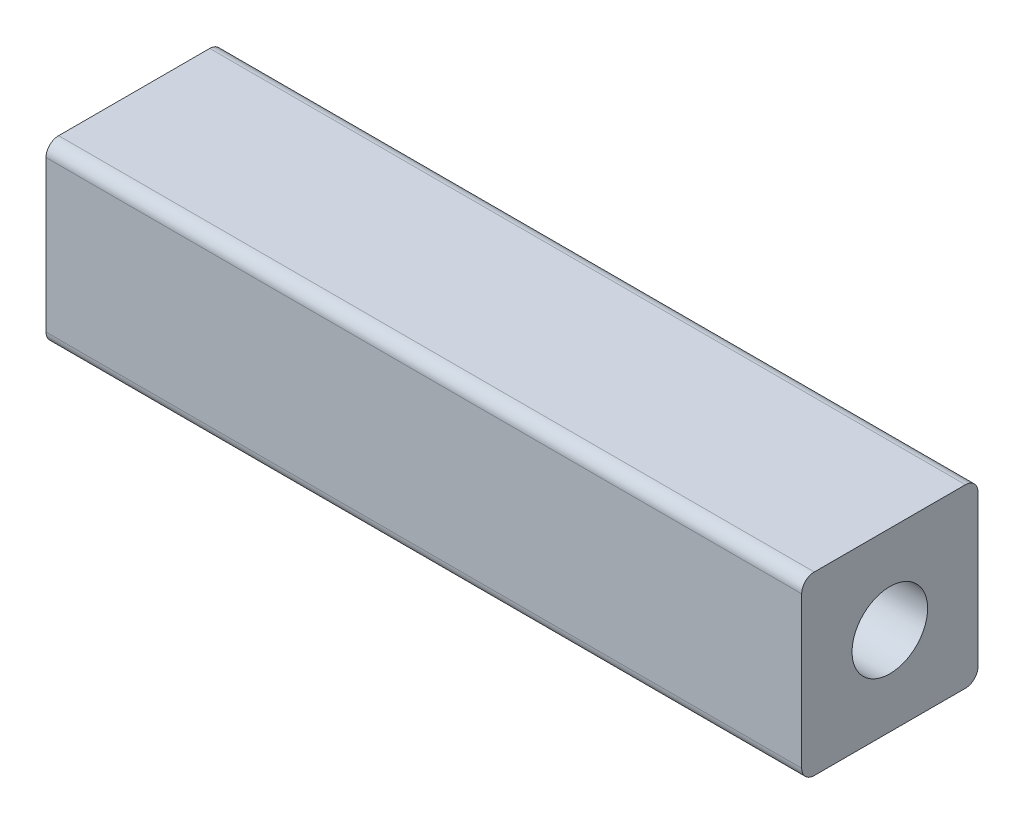
ISO-10303-21;
HEADER;
FILE_DESCRIPTION(('STEP AP214'),'2;1');
FILE_NAME('part.step','',(''),(''),'','','');
FILE_SCHEMA(('AUTOMOTIVE_DESIGN { 1 0 10303 214 1 1 1 1 }'));
ENDSEC;
DATA;
#1=APPLICATION_CONTEXT('core data for automotive mechanical design processes');
#2=APPLICATION_PROTOCOL_DEFINITION('international standard','automotive_design',2000,#1);
#3=PRODUCT_CONTEXT('',#1,'mechanical');
#4=PRODUCT('Part','Part','',(#3));
#5=PRODUCT_RELATED_PRODUCT_CATEGORY('part','',(#4));
#6=PRODUCT_DEFINITION_FORMATION('','',#4);
#7=PRODUCT_DEFINITION_CONTEXT('part definition',#1,'design');
#8=PRODUCT_DEFINITION('design','',#6,#7);
#9=PRODUCT_DEFINITION_SHAPE('','',#8);
#10=(LENGTH_UNIT() NAMED_UNIT(*) SI_UNIT(.MILLI.,.METRE.));
#11=(NAMED_UNIT(*) PLANE_ANGLE_UNIT() SI_UNIT($,.RADIAN.));
#12=(NAMED_UNIT(*) SI_UNIT($,.STERADIAN.) SOLID_ANGLE_UNIT());
#13=UNCERTAINTY_MEASURE_WITH_UNIT(LENGTH_MEASURE(1.E-05),#10,'distance_accuracy_value','');
#14=(GEOMETRIC_REPRESENTATION_CONTEXT(3) GLOBAL_UNCERTAINTY_ASSIGNED_CONTEXT((#13)) GLOBAL_UNIT_ASSIGNED_CONTEXT((#10,
#11,#12)) REPRESENTATION_CONTEXT('',''));
#15=CARTESIAN_POINT('',(0.,0.,0.));
#16=DIRECTION('',(0.,0.,1.));
#17=DIRECTION('',(1.,0.,0.));
#18=AXIS2_PLACEMENT_3D('',#15,#16,#17);
#19=CARTESIAN_POINT('',(60.,7.,-7.));
#20=DIRECTION('',(0.,0.,1.));
#21=DIRECTION('',(0.,-1.,0.));
#22=AXIS2_PLACEMENT_3D('',#19,#20,#21);
#23=PLANE('',#22);
#24=DIRECTION('',(0.,1.,0.));
#25=VECTOR('',#24,1.);
#26=CARTESIAN_POINT('',(60.,7.,-7.));
#27=LINE('',#26,#25);
#28=CARTESIAN_POINT('',(60.,-6.,-7.));
#29=VERTEX_POINT('',#28);
#30=CARTESIAN_POINT('',(60.,6.,-7.));
#31=VERTEX_POINT('',#30);
#32=EDGE_CURVE('E122',#29,#31,#27,.T.);
#33=ORIENTED_EDGE('',*,*,#32,.F.);
#34=DIRECTION('',(-1.,0.,0.));
#35=VECTOR('',#34,1.);
#36=CARTESIAN_POINT('',(60.,-6.,-7.));
#37=LINE('',#36,#35);
#38=CARTESIAN_POINT('',(0.,-6.,-7.));
#39=VERTEX_POINT('',#38);
#40=EDGE_CURVE('E107',#29,#39,#37,.T.);
#41=ORIENTED_EDGE('',*,*,#40,.T.);
#42=DIRECTION('',(0.,1.,0.));
#43=VECTOR('',#42,1.);
#44=CARTESIAN_POINT('',(0.,7.,-7.));
#45=LINE('',#44,#43);
#46=CARTESIAN_POINT('',(0.,6.,-7.));
#47=VERTEX_POINT('',#46);
#48=EDGE_CURVE('E119',#39,#47,#45,.T.);
#49=ORIENTED_EDGE('',*,*,#48,.T.);
#50=DIRECTION('',(-1.,0.,0.));
#51=VECTOR('',#50,1.);
#52=CARTESIAN_POINT('',(60.,6.,-7.));
#53=LINE('',#52,#51);
#54=EDGE_CURVE('E124',#47,#31,#53,.F.);
#55=ORIENTED_EDGE('',*,*,#54,.T.);
#56=EDGE_LOOP('',(#33,#41,#49,#55));
#57=FACE_BOUND('',#56,.T.);
#58=ADVANCED_FACE('F37',(#57),#23,.F.);
#59=CARTESIAN_POINT('',(60.,7.,7.));
#60=DIRECTION('',(0.,-1.,0.));
#61=DIRECTION('',(0.,0.,-1.));
#62=AXIS2_PLACEMENT_3D('',#59,#60,#61);
#63=PLANE('',#62);
#64=DIRECTION('',(0.,0.,1.));
#65=VECTOR('',#64,1.);
#66=CARTESIAN_POINT('',(0.,7.,7.));
#67=LINE('',#66,#65);
#68=CARTESIAN_POINT('',(0.,7.,-6.));
#69=VERTEX_POINT('',#68);
#70=CARTESIAN_POINT('',(0.,7.,6.));
#71=VERTEX_POINT('',#70);
#72=EDGE_CURVE('E128',#69,#71,#67,.T.);
#73=ORIENTED_EDGE('',*,*,#72,.T.);
#74=DIRECTION('',(-1.,0.,0.));
#75=VECTOR('',#74,1.);
#76=CARTESIAN_POINT('',(60.,7.,6.));
#77=LINE('',#76,#75);
#78=CARTESIAN_POINT('',(60.,7.,6.));
#79=VERTEX_POINT('',#78);
#80=EDGE_CURVE('E11',#71,#79,#77,.F.);
#81=ORIENTED_EDGE('',*,*,#80,.T.);
#82=DIRECTION('',(0.,0.,1.));
#83=VECTOR('',#82,1.);
#84=CARTESIAN_POINT('',(60.,7.,7.));
#85=LINE('',#84,#83);
#86=CARTESIAN_POINT('',(60.,7.,-6.));
#87=VERTEX_POINT('',#86);
#88=EDGE_CURVE('E168',#87,#79,#85,.T.);
#89=ORIENTED_EDGE('',*,*,#88,.F.);
#90=DIRECTION('',(-1.,0.,0.));
#91=VECTOR('',#90,1.);
#92=CARTESIAN_POINT('',(60.,7.,-6.));
#93=LINE('',#92,#91);
#94=EDGE_CURVE('E45',#87,#69,#93,.T.);
#95=ORIENTED_EDGE('',*,*,#94,.T.);
#96=EDGE_LOOP('',(#73,#81,#89,#95));
#97=FACE_BOUND('',#96,.T.);
#98=ADVANCED_FACE('F166',(#97),#63,.F.);
#99=CARTESIAN_POINT('',(60.,7.,7.));
#100=DIRECTION('',(0.,0.,-1.));
#101=DIRECTION('',(0.,1.,0.));
#102=AXIS2_PLACEMENT_3D('',#99,#100,#101);
#103=PLANE('',#102);
#104=DIRECTION('',(0.,-1.,0.));
#105=VECTOR('',#104,1.);
#106=CARTESIAN_POINT('',(0.,7.,7.));
#107=LINE('',#106,#105);
#108=CARTESIAN_POINT('',(0.,6.,7.));
#109=VERTEX_POINT('',#108);
#110=CARTESIAN_POINT('',(0.,-6.,7.));
#111=VERTEX_POINT('',#110);
#112=EDGE_CURVE('E132',#109,#111,#107,.T.);
#113=ORIENTED_EDGE('',*,*,#112,.T.);
#114=DIRECTION('',(-1.,0.,0.));
#115=VECTOR('',#114,1.);
#116=CARTESIAN_POINT('',(60.,-6.,7.));
#117=LINE('',#116,#115);
#118=CARTESIAN_POINT('',(60.,-6.,7.));
#119=VERTEX_POINT('',#118);
#120=EDGE_CURVE('E52',#111,#119,#117,.F.);
#121=ORIENTED_EDGE('',*,*,#120,.T.);
#122=DIRECTION('',(0.,-1.,0.));
#123=VECTOR('',#122,1.);
#124=CARTESIAN_POINT('',(60.,7.,7.));
#125=LINE('',#124,#123);
#126=CARTESIAN_POINT('',(60.,6.,7.));
#127=VERTEX_POINT('',#126);
#128=EDGE_CURVE('E176',#127,#119,#125,.T.);
#129=ORIENTED_EDGE('',*,*,#128,.F.);
#130=DIRECTION('',(-1.,0.,0.));
#131=VECTOR('',#130,1.);
#132=CARTESIAN_POINT('',(60.,6.,7.));
#133=LINE('',#132,#131);
#134=EDGE_CURVE('E159',#127,#109,#133,.T.);
#135=ORIENTED_EDGE('',*,*,#134,.T.);
#136=EDGE_LOOP('',(#113,#121,#129,#135));
#137=FACE_BOUND('',#136,.T.);
#138=ADVANCED_FACE('F175',(#137),#103,.F.);
#139=CARTESIAN_POINT('',(60.,-7.,7.));
#140=DIRECTION('',(0.,1.,0.));
#141=DIRECTION('',(0.,0.,1.));
#142=AXIS2_PLACEMENT_3D('',#139,#140,#141);
#143=PLANE('',#142);
#144=DIRECTION('',(0.,0.,-1.));
#145=VECTOR('',#144,1.);
#146=CARTESIAN_POINT('',(0.,-7.,7.));
#147=LINE('',#146,#145);
#148=CARTESIAN_POINT('',(0.,-7.,6.));
#149=VERTEX_POINT('',#148);
#150=CARTESIAN_POINT('',(0.,-7.,-6.));
#151=VERTEX_POINT('',#150);
#152=EDGE_CURVE('E142',#149,#151,#147,.T.);
#153=ORIENTED_EDGE('',*,*,#152,.T.);
#154=DIRECTION('',(-1.,0.,0.));
#155=VECTOR('',#154,1.);
#156=CARTESIAN_POINT('',(60.,-7.,-6.));
#157=LINE('',#156,#155);
#158=CARTESIAN_POINT('',(60.,-7.,-6.));
#159=VERTEX_POINT('',#158);
#160=EDGE_CURVE('E108',#151,#159,#157,.F.);
#161=ORIENTED_EDGE('',*,*,#160,.T.);
#162=DIRECTION('',(0.,0.,-1.));
#163=VECTOR('',#162,1.);
#164=CARTESIAN_POINT('',(60.,-7.,7.));
#165=LINE('',#164,#163);
#166=CARTESIAN_POINT('',(60.,-7.,6.));
#167=VERTEX_POINT('',#166);
#168=EDGE_CURVE('E138',#167,#159,#165,.T.);
#169=ORIENTED_EDGE('',*,*,#168,.F.);
#170=DIRECTION('',(-1.,0.,0.));
#171=VECTOR('',#170,1.);
#172=CARTESIAN_POINT('',(60.,-7.,6.));
#173=LINE('',#172,#171);
#174=EDGE_CURVE('E113',#167,#149,#173,.T.);
#175=ORIENTED_EDGE('',*,*,#174,.T.);
#176=EDGE_LOOP('',(#153,#161,#169,#175));
#177=FACE_BOUND('',#176,.T.);
#178=ADVANCED_FACE('F189',(#177),#143,.F.);
#179=CARTESIAN_POINT('',(60.,0.,0.));
#180=DIRECTION('',(1.,0.,0.));
#181=DIRECTION('',(0.,0.,-1.));
#182=AXIS2_PLACEMENT_3D('',#179,#180,#181);
#183=PLANE('',#182);
#184=CARTESIAN_POINT('',(60.,0.,0.));
#185=DIRECTION('',(1.,0.,0.));
#186=DIRECTION('',(0.,0.,-1.));
#187=AXIS2_PLACEMENT_3D('',#184,#185,#186);
#188=CIRCLE('',#187,3.);
#189=CARTESIAN_POINT('',(60.,0.,-3.));
#190=VERTEX_POINT('',#189);
#191=EDGE_CURVE('E135',#190,#190,#188,.T.);
#192=ORIENTED_EDGE('',*,*,#191,.F.);
#193=EDGE_LOOP('',(#192));
#194=FACE_BOUND('',#193,.T.);
#195=ORIENTED_EDGE('',*,*,#168,.T.);
#196=CARTESIAN_POINT('',(60.,-6.,-6.));
#197=DIRECTION('',(1.,0.,0.));
#198=DIRECTION('',(0.,0.,-1.));
#199=AXIS2_PLACEMENT_3D('',#196,#197,#198);
#200=CIRCLE('',#199,1.);
#201=EDGE_CURVE('E157',#159,#29,#200,.T.);
#202=ORIENTED_EDGE('',*,*,#201,.T.);
#203=ORIENTED_EDGE('',*,*,#32,.T.);
#204=CARTESIAN_POINT('',(60.,6.,-6.));
#205=DIRECTION('',(1.,0.,0.));
#206=DIRECTION('',(0.,0.,-1.));
#207=AXIS2_PLACEMENT_3D('',#204,#205,#206);
#208=CIRCLE('',#207,1.);
#209=EDGE_CURVE('E152',#31,#87,#208,.T.);
#210=ORIENTED_EDGE('',*,*,#209,.T.);
#211=ORIENTED_EDGE('',*,*,#88,.T.);
#212=CARTESIAN_POINT('',(60.,6.,6.));
#213=DIRECTION('',(1.,0.,0.));
#214=DIRECTION('',(0.,0.,-1.));
#215=AXIS2_PLACEMENT_3D('',#212,#213,#214);
#216=CIRCLE('',#215,1.);
#217=EDGE_CURVE('E59',#79,#127,#216,.T.);
#218=ORIENTED_EDGE('',*,*,#217,.T.);
#219=ORIENTED_EDGE('',*,*,#128,.T.);
#220=CARTESIAN_POINT('',(60.,-6.,6.));
#221=DIRECTION('',(1.,0.,0.));
#222=DIRECTION('',(0.,0.,-1.));
#223=AXIS2_PLACEMENT_3D('',#220,#221,#222);
#224=CIRCLE('',#223,1.);
#225=EDGE_CURVE('E155',#119,#167,#224,.T.);
#226=ORIENTED_EDGE('',*,*,#225,.T.);
#227=EDGE_LOOP('',(#195,#202,#203,#210,#211,#218,#219,#226));
#228=FACE_BOUND('',#227,.T.);
#229=ADVANCED_FACE('F187',(#194,#228),#183,.T.);
#230=CARTESIAN_POINT('',(0.,0.,0.));
#231=DIRECTION('',(1.,0.,0.));
#232=DIRECTION('',(0.,0.,-1.));
#233=AXIS2_PLACEMENT_3D('',#230,#231,#232);
#234=PLANE('',#233);
#235=ORIENTED_EDGE('',*,*,#48,.F.);
#236=CARTESIAN_POINT('',(0.,-6.,-6.));
#237=DIRECTION('',(1.,0.,0.));
#238=DIRECTION('',(0.,0.,-1.));
#239=AXIS2_PLACEMENT_3D('',#236,#237,#238);
#240=CIRCLE('',#239,1.);
#241=EDGE_CURVE('E103',#39,#151,#240,.F.);
#242=ORIENTED_EDGE('',*,*,#241,.T.);
#243=ORIENTED_EDGE('',*,*,#152,.F.);
#244=CARTESIAN_POINT('',(0.,-6.,6.));
#245=DIRECTION('',(1.,0.,0.));
#246=DIRECTION('',(0.,0.,-1.));
#247=AXIS2_PLACEMENT_3D('',#244,#245,#246);
#248=CIRCLE('',#247,1.);
#249=EDGE_CURVE('E114',#149,#111,#248,.F.);
#250=ORIENTED_EDGE('',*,*,#249,.T.);
#251=ORIENTED_EDGE('',*,*,#112,.F.);
#252=CARTESIAN_POINT('',(0.,6.,6.));
#253=DIRECTION('',(1.,0.,0.));
#254=DIRECTION('',(0.,0.,-1.));
#255=AXIS2_PLACEMENT_3D('',#252,#253,#254);
#256=CIRCLE('',#255,1.);
#257=EDGE_CURVE('E146',#109,#71,#256,.F.);
#258=ORIENTED_EDGE('',*,*,#257,.T.);
#259=ORIENTED_EDGE('',*,*,#72,.F.);
#260=CARTESIAN_POINT('',(0.,6.,-6.));
#261=DIRECTION('',(1.,0.,0.));
#262=DIRECTION('',(0.,0.,-1.));
#263=AXIS2_PLACEMENT_3D('',#260,#261,#262);
#264=CIRCLE('',#263,1.);
#265=EDGE_CURVE('E123',#69,#47,#264,.F.);
#266=ORIENTED_EDGE('',*,*,#265,.T.);
#267=EDGE_LOOP('',(#235,#242,#243,#250,#251,#258,#259,#266));
#268=FACE_BOUND('',#267,.T.);
#269=ADVANCED_FACE('F126',(#268),#234,.F.);
#270=CARTESIAN_POINT('',(60.,-6.,-6.));
#271=DIRECTION('',(-1.,0.,0.));
#272=DIRECTION('',(0.,0.,1.));
#273=AXIS2_PLACEMENT_3D('',#270,#271,#272);
#274=CYLINDRICAL_SURFACE('',#273,1.);
#275=ORIENTED_EDGE('',*,*,#201,.F.);
#276=ORIENTED_EDGE('',*,*,#160,.F.);
#277=ORIENTED_EDGE('',*,*,#241,.F.);
#278=ORIENTED_EDGE('',*,*,#40,.F.);
#279=EDGE_LOOP('',(#275,#276,#277,#278));
#280=FACE_BOUND('',#279,.T.);
#281=ADVANCED_FACE('F106',(#280),#274,.T.);
#282=CARTESIAN_POINT('',(60.,-6.,6.));
#283=DIRECTION('',(-1.,0.,0.));
#284=DIRECTION('',(0.,0.,1.));
#285=AXIS2_PLACEMENT_3D('',#282,#283,#284);
#286=CYLINDRICAL_SURFACE('',#285,1.);
#287=ORIENTED_EDGE('',*,*,#225,.F.);
#288=ORIENTED_EDGE('',*,*,#120,.F.);
#289=ORIENTED_EDGE('',*,*,#249,.F.);
#290=ORIENTED_EDGE('',*,*,#174,.F.);
#291=EDGE_LOOP('',(#287,#288,#289,#290));
#292=FACE_BOUND('',#291,.T.);
#293=ADVANCED_FACE('F195',(#292),#286,.T.);
#294=CARTESIAN_POINT('',(60.,6.,6.));
#295=DIRECTION('',(-1.,0.,0.));
#296=DIRECTION('',(0.,0.,1.));
#297=AXIS2_PLACEMENT_3D('',#294,#295,#296);
#298=CYLINDRICAL_SURFACE('',#297,1.);
#299=ORIENTED_EDGE('',*,*,#217,.F.);
#300=ORIENTED_EDGE('',*,*,#80,.F.);
#301=ORIENTED_EDGE('',*,*,#257,.F.);
#302=ORIENTED_EDGE('',*,*,#134,.F.);
#303=EDGE_LOOP('',(#299,#300,#301,#302));
#304=FACE_BOUND('',#303,.T.);
#305=ADVANCED_FACE('F174',(#304),#298,.T.);
#306=CARTESIAN_POINT('',(60.,6.,-6.));
#307=DIRECTION('',(-1.,0.,0.));
#308=DIRECTION('',(0.,0.,1.));
#309=AXIS2_PLACEMENT_3D('',#306,#307,#308);
#310=CYLINDRICAL_SURFACE('',#309,1.);
#311=ORIENTED_EDGE('',*,*,#209,.F.);
#312=ORIENTED_EDGE('',*,*,#54,.F.);
#313=ORIENTED_EDGE('',*,*,#265,.F.);
#314=ORIENTED_EDGE('',*,*,#94,.F.);
#315=EDGE_LOOP('',(#311,#312,#313,#314));
#316=FACE_BOUND('',#315,.T.);
#317=ADVANCED_FACE('F39',(#316),#310,.T.);
#318=CARTESIAN_POINT('',(16.,0.,0.));
#319=DIRECTION('',(1.,0.,0.));
#320=DIRECTION('',(0.,0.,-1.));
#321=AXIS2_PLACEMENT_3D('',#318,#319,#320);
#322=CYLINDRICAL_SURFACE('',#321,3.);
#323=CARTESIAN_POINT('',(16.,0.,0.));
#324=DIRECTION('',(1.,0.,0.));
#325=DIRECTION('',(0.,0.,-1.));
#326=AXIS2_PLACEMENT_3D('',#323,#324,#325);
#327=CIRCLE('',#326,3.);
#328=CARTESIAN_POINT('',(16.,0.,-3.));
#329=VERTEX_POINT('',#328);
#330=EDGE_CURVE('E129',#329,#329,#327,.T.);
#331=ORIENTED_EDGE('',*,*,#330,.F.);
#332=EDGE_LOOP('',(#331));
#333=FACE_BOUND('',#332,.T.);
#334=ORIENTED_EDGE('',*,*,#191,.T.);
#335=EDGE_LOOP('',(#334));
#336=FACE_BOUND('',#335,.T.);
#337=ADVANCED_FACE('F185',(#333,#336),#322,.F.);
#338=CARTESIAN_POINT('',(16.,0.,0.));
#339=DIRECTION('',(1.,0.,0.));
#340=DIRECTION('',(0.,0.,-1.));
#341=AXIS2_PLACEMENT_3D('',#338,#339,#340);
#342=PLANE('',#341);
#343=ORIENTED_EDGE('',*,*,#330,.T.);
#344=EDGE_LOOP('',(#343));
#345=FACE_BOUND('',#344,.T.);
#346=ADVANCED_FACE('F218',(#345),#342,.T.);
#347=CLOSED_SHELL('',(#58,#98,#138,#178,#229,#269,#281,#293,#305,#317,#337,#346));
#348=MANIFOLD_SOLID_BREP('B2',#347);
#349=ADVANCED_BREP_SHAPE_REPRESENTATION('',(#18,#348),#14);
#350=SHAPE_DEFINITION_REPRESENTATION(#9,#349);
ENDSEC;
END-ISO-10303-21;
